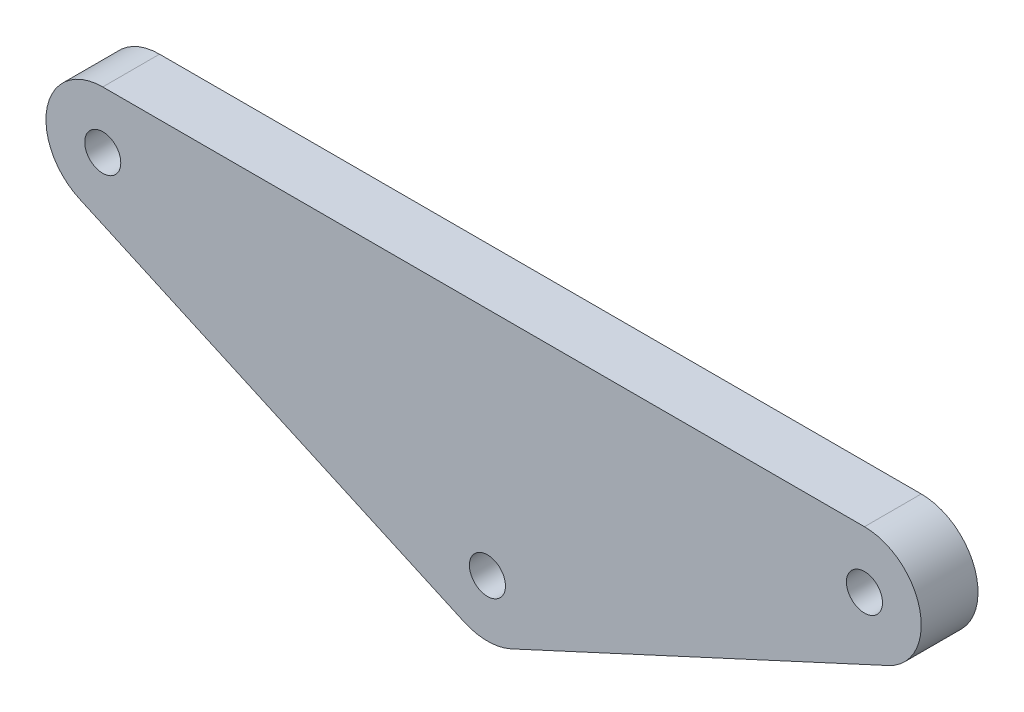
ISO-10303-21;
HEADER;
FILE_DESCRIPTION(('STEP AP214'),'2;1');
FILE_NAME('part.step','',(''),(''),'','','');
FILE_SCHEMA(('AUTOMOTIVE_DESIGN { 1 0 10303 214 1 1 1 1 }'));
ENDSEC;
DATA;
#1=APPLICATION_CONTEXT('core data for automotive mechanical design processes');
#2=APPLICATION_PROTOCOL_DEFINITION('international standard','automotive_design',2000,#1);
#3=PRODUCT_CONTEXT('',#1,'mechanical');
#4=PRODUCT('Part','Part','',(#3));
#5=PRODUCT_RELATED_PRODUCT_CATEGORY('part','',(#4));
#6=PRODUCT_DEFINITION_FORMATION('','',#4);
#7=PRODUCT_DEFINITION_CONTEXT('part definition',#1,'design');
#8=PRODUCT_DEFINITION('design','',#6,#7);
#9=PRODUCT_DEFINITION_SHAPE('','',#8);
#10=(LENGTH_UNIT() NAMED_UNIT(*) SI_UNIT(.MILLI.,.METRE.));
#11=(NAMED_UNIT(*) PLANE_ANGLE_UNIT() SI_UNIT($,.RADIAN.));
#12=(NAMED_UNIT(*) SI_UNIT($,.STERADIAN.) SOLID_ANGLE_UNIT());
#13=UNCERTAINTY_MEASURE_WITH_UNIT(LENGTH_MEASURE(1.E-05),#10,'distance_accuracy_value','');
#14=(GEOMETRIC_REPRESENTATION_CONTEXT(3) GLOBAL_UNCERTAINTY_ASSIGNED_CONTEXT((#13)) GLOBAL_UNIT_ASSIGNED_CONTEXT((#10,
#11,#12)) REPRESENTATION_CONTEXT('',''));
#15=CARTESIAN_POINT('',(0.,0.,0.));
#16=DIRECTION('',(0.,0.,1.));
#17=DIRECTION('',(1.,0.,0.));
#18=AXIS2_PLACEMENT_3D('',#15,#16,#17);
#19=CARTESIAN_POINT('',(-33.54,0.,2.5));
#20=DIRECTION('',(0.,0.,-1.));
#21=DIRECTION('',(-1.,0.,0.));
#22=AXIS2_PLACEMENT_3D('',#19,#20,#21);
#23=CYLINDRICAL_SURFACE('',#22,5.);
#24=CARTESIAN_POINT('',(-33.54,0.,-2.5));
#25=DIRECTION('',(0.,0.,1.));
#26=DIRECTION('',(1.,0.,0.));
#27=AXIS2_PLACEMENT_3D('',#24,#25,#26);
#28=CIRCLE('',#27,5.);
#29=CARTESIAN_POINT('',(-33.54,5.,-2.5));
#30=VERTEX_POINT('',#29);
#31=CARTESIAN_POINT('',(-35.6012701010741,-4.55534472574997,-2.5));
#32=VERTEX_POINT('',#31);
#33=EDGE_CURVE('E123',#30,#32,#28,.T.);
#34=ORIENTED_EDGE('',*,*,#33,.T.);
#35=DIRECTION('',(0.,0.,-1.));
#36=VECTOR('',#35,1.);
#37=CARTESIAN_POINT('',(-35.6012701010741,-4.55534472574997,2.5));
#38=LINE('',#37,#36);
#39=CARTESIAN_POINT('',(-35.6012701010741,-4.55534472574997,2.5));
#40=VERTEX_POINT('',#39);
#41=EDGE_CURVE('E11',#40,#32,#38,.T.);
#42=ORIENTED_EDGE('',*,*,#41,.F.);
#43=CARTESIAN_POINT('',(-33.54,0.,2.5));
#44=DIRECTION('',(0.,0.,1.));
#45=DIRECTION('',(1.,0.,0.));
#46=AXIS2_PLACEMENT_3D('',#43,#44,#45);
#47=CIRCLE('',#46,5.);
#48=CARTESIAN_POINT('',(-33.54,5.,2.5));
#49=VERTEX_POINT('',#48);
#50=EDGE_CURVE('E134',#49,#40,#47,.T.);
#51=ORIENTED_EDGE('',*,*,#50,.F.);
#52=DIRECTION('',(0.,0.,-1.));
#53=VECTOR('',#52,1.);
#54=CARTESIAN_POINT('',(-33.54,5.,2.5));
#55=LINE('',#54,#53);
#56=EDGE_CURVE('E119',#49,#30,#55,.T.);
#57=ORIENTED_EDGE('',*,*,#56,.T.);
#58=EDGE_LOOP('',(#34,#42,#51,#57));
#59=FACE_BOUND('',#58,.T.);
#60=ADVANCED_FACE('F39',(#59),#23,.T.);
#61=CARTESIAN_POINT('',(-1.72317137567157,-19.8850104674379,2.5));
#62=DIRECTION('',(0.412254020214816,0.911068945149994,0.));
#63=DIRECTION('',(-0.911068945149994,0.412254020214816,0.));
#64=AXIS2_PLACEMENT_3D('',#61,#62,#63);
#65=PLANE('',#64);
#66=DIRECTION('',(0.911068945149994,-0.412254020214816,0.));
#67=VECTOR('',#66,1.);
#68=CARTESIAN_POINT('',(-1.72317137567157,-19.8850104674379,-2.5));
#69=LINE('',#68,#67);
#70=CARTESIAN_POINT('',(-1.72317137567157,-19.8850104674379,-2.5));
#71=VERTEX_POINT('',#70);
#72=EDGE_CURVE('E126',#32,#71,#69,.T.);
#73=ORIENTED_EDGE('',*,*,#72,.T.);
#74=DIRECTION('',(0.,0.,-1.));
#75=VECTOR('',#74,1.);
#76=CARTESIAN_POINT('',(-1.72317137567157,-19.8850104674379,2.5));
#77=LINE('',#76,#75);
#78=CARTESIAN_POINT('',(-1.72317137567157,-19.8850104674379,2.5));
#79=VERTEX_POINT('',#78);
#80=EDGE_CURVE('E47',#79,#71,#77,.T.);
#81=ORIENTED_EDGE('',*,*,#80,.F.);
#82=DIRECTION('',(0.911068945149994,-0.412254020214816,0.));
#83=VECTOR('',#82,1.);
#84=CARTESIAN_POINT('',(-1.72317137567157,-19.8850104674379,2.5));
#85=LINE('',#84,#83);
#86=EDGE_CURVE('E92',#40,#79,#85,.T.);
#87=ORIENTED_EDGE('',*,*,#86,.F.);
#88=ORIENTED_EDGE('',*,*,#41,.T.);
#89=EDGE_LOOP('',(#73,#81,#87,#88));
#90=FACE_BOUND('',#89,.T.);
#91=ADVANCED_FACE('F160',(#90),#65,.F.);
#92=CARTESIAN_POINT('',(0.338098725402507,-15.3296657416879,2.5));
#93=DIRECTION('',(0.,0.,-1.));
#94=DIRECTION('',(-1.,0.,0.));
#95=AXIS2_PLACEMENT_3D('',#92,#93,#94);
#96=CYLINDRICAL_SURFACE('',#95,5.);
#97=CARTESIAN_POINT('',(0.338098725402507,-15.3296657416879,-2.5));
#98=DIRECTION('',(0.,0.,1.));
#99=DIRECTION('',(1.,0.,0.));
#100=AXIS2_PLACEMENT_3D('',#97,#98,#99);
#101=CIRCLE('',#100,5.);
#102=CARTESIAN_POINT('',(2.43403333596963,-19.8691655057838,-2.5));
#103=VERTEX_POINT('',#102);
#104=EDGE_CURVE('E129',#71,#103,#101,.T.);
#105=ORIENTED_EDGE('',*,*,#104,.T.);
#106=DIRECTION('',(0.,0.,-1.));
#107=VECTOR('',#106,1.);
#108=CARTESIAN_POINT('',(2.43403333596963,-19.8691655057838,2.5));
#109=LINE('',#108,#107);
#110=CARTESIAN_POINT('',(2.43403333596963,-19.8691655057838,2.5));
#111=VERTEX_POINT('',#110);
#112=EDGE_CURVE('E114',#111,#103,#109,.T.);
#113=ORIENTED_EDGE('',*,*,#112,.F.);
#114=CARTESIAN_POINT('',(0.338098725402507,-15.3296657416879,2.5));
#115=DIRECTION('',(0.,0.,1.));
#116=DIRECTION('',(1.,0.,0.));
#117=AXIS2_PLACEMENT_3D('',#114,#115,#116);
#118=CIRCLE('',#117,5.);
#119=EDGE_CURVE('E105',#79,#111,#118,.T.);
#120=ORIENTED_EDGE('',*,*,#119,.F.);
#121=ORIENTED_EDGE('',*,*,#80,.T.);
#122=EDGE_LOOP('',(#105,#113,#120,#121));
#123=FACE_BOUND('',#122,.T.);
#124=ADVANCED_FACE('F140',(#123),#96,.T.);
#125=CARTESIAN_POINT('',(2.43403333596963,-19.8691655057838,2.5));
#126=DIRECTION('',(-0.419186922113425,0.907899952819182,0.));
#127=DIRECTION('',(-0.907899952819182,-0.419186922113425,0.));
#128=AXIS2_PLACEMENT_3D('',#125,#126,#127);
#129=PLANE('',#128);
#130=DIRECTION('',(0.907899952819182,0.419186922113425,0.));
#131=VECTOR('',#130,1.);
#132=CARTESIAN_POINT('',(2.43403333596963,-19.8691655057838,-2.5));
#133=LINE('',#132,#131);
#134=CARTESIAN_POINT('',(35.6359346105671,-4.53949976409591,-2.5));
#135=VERTEX_POINT('',#134);
#136=EDGE_CURVE('E113',#103,#135,#133,.T.);
#137=ORIENTED_EDGE('',*,*,#136,.T.);
#138=DIRECTION('',(0.,0.,-1.));
#139=VECTOR('',#138,1.);
#140=CARTESIAN_POINT('',(35.6359346105671,-4.53949976409591,2.5));
#141=LINE('',#140,#139);
#142=CARTESIAN_POINT('',(35.6359346105671,-4.53949976409591,2.5));
#143=VERTEX_POINT('',#142);
#144=EDGE_CURVE('E110',#143,#135,#141,.T.);
#145=ORIENTED_EDGE('',*,*,#144,.F.);
#146=DIRECTION('',(0.907899952819182,0.419186922113425,0.));
#147=VECTOR('',#146,1.);
#148=CARTESIAN_POINT('',(2.43403333596963,-19.8691655057838,2.5));
#149=LINE('',#148,#147);
#150=EDGE_CURVE('E99',#111,#143,#149,.T.);
#151=ORIENTED_EDGE('',*,*,#150,.F.);
#152=ORIENTED_EDGE('',*,*,#112,.T.);
#153=EDGE_LOOP('',(#137,#145,#151,#152));
#154=FACE_BOUND('',#153,.T.);
#155=ADVANCED_FACE('F111',(#154),#129,.F.);
#156=CARTESIAN_POINT('',(33.54,0.,2.5));
#157=DIRECTION('',(0.,0.,-1.));
#158=DIRECTION('',(-1.,0.,0.));
#159=AXIS2_PLACEMENT_3D('',#156,#157,#158);
#160=CYLINDRICAL_SURFACE('',#159,5.);
#161=CARTESIAN_POINT('',(33.54,0.,-2.5));
#162=DIRECTION('',(0.,0.,1.));
#163=DIRECTION('',(-1.,0.,0.));
#164=AXIS2_PLACEMENT_3D('',#161,#162,#163);
#165=CIRCLE('',#164,5.);
#166=CARTESIAN_POINT('',(33.54,5.,-2.5));
#167=VERTEX_POINT('',#166);
#168=EDGE_CURVE('E78',#135,#167,#165,.T.);
#169=ORIENTED_EDGE('',*,*,#168,.T.);
#170=DIRECTION('',(0.,0.,-1.));
#171=VECTOR('',#170,1.);
#172=CARTESIAN_POINT('',(33.54,5.,2.5));
#173=LINE('',#172,#171);
#174=CARTESIAN_POINT('',(33.54,5.,2.5));
#175=VERTEX_POINT('',#174);
#176=EDGE_CURVE('E115',#175,#167,#173,.T.);
#177=ORIENTED_EDGE('',*,*,#176,.F.);
#178=CARTESIAN_POINT('',(33.54,0.,2.5));
#179=DIRECTION('',(0.,0.,1.));
#180=DIRECTION('',(-1.,0.,0.));
#181=AXIS2_PLACEMENT_3D('',#178,#179,#180);
#182=CIRCLE('',#181,5.);
#183=EDGE_CURVE('E103',#143,#175,#182,.T.);
#184=ORIENTED_EDGE('',*,*,#183,.F.);
#185=ORIENTED_EDGE('',*,*,#144,.T.);
#186=EDGE_LOOP('',(#169,#177,#184,#185));
#187=FACE_BOUND('',#186,.T.);
#188=ADVANCED_FACE('F117',(#187),#160,.T.);
#189=CARTESIAN_POINT('',(-33.54,5.,2.5));
#190=DIRECTION('',(0.,-1.,0.));
#191=DIRECTION('',(0.,0.,-1.));
#192=AXIS2_PLACEMENT_3D('',#189,#190,#191);
#193=PLANE('',#192);
#194=DIRECTION('',(-1.,0.,0.));
#195=VECTOR('',#194,1.);
#196=CARTESIAN_POINT('',(-33.54,5.,-2.5));
#197=LINE('',#196,#195);
#198=EDGE_CURVE('E84',#167,#30,#197,.T.);
#199=ORIENTED_EDGE('',*,*,#198,.T.);
#200=ORIENTED_EDGE('',*,*,#56,.F.);
#201=DIRECTION('',(-1.,0.,0.));
#202=VECTOR('',#201,1.);
#203=CARTESIAN_POINT('',(-33.54,5.,2.5));
#204=LINE('',#203,#202);
#205=EDGE_CURVE('E55',#175,#49,#204,.T.);
#206=ORIENTED_EDGE('',*,*,#205,.F.);
#207=ORIENTED_EDGE('',*,*,#176,.T.);
#208=EDGE_LOOP('',(#199,#200,#206,#207));
#209=FACE_BOUND('',#208,.T.);
#210=ADVANCED_FACE('F147',(#209),#193,.F.);
#211=CARTESIAN_POINT('',(-33.54,0.,2.5));
#212=DIRECTION('',(0.,0.,1.));
#213=DIRECTION('',(1.,0.,0.));
#214=AXIS2_PLACEMENT_3D('',#211,#212,#213);
#215=PLANE('',#214);
#216=CARTESIAN_POINT('',(-33.54,0.,2.5));
#217=DIRECTION('',(0.,0.,1.));
#218=DIRECTION('',(1.,0.,0.));
#219=AXIS2_PLACEMENT_3D('',#216,#217,#218);
#220=CIRCLE('',#219,1.5875);
#221=CARTESIAN_POINT('',(-31.9525,0.,2.5));
#222=VERTEX_POINT('',#221);
#223=EDGE_CURVE('E230',#222,#222,#220,.T.);
#224=ORIENTED_EDGE('',*,*,#223,.F.);
#225=EDGE_LOOP('',(#224));
#226=FACE_BOUND('',#225,.T.);
#227=CARTESIAN_POINT('',(33.54,0.,2.5));
#228=DIRECTION('',(0.,0.,1.));
#229=DIRECTION('',(1.,0.,0.));
#230=AXIS2_PLACEMENT_3D('',#227,#228,#229);
#231=CIRCLE('',#230,1.5875);
#232=CARTESIAN_POINT('',(35.1275,0.,2.5));
#233=VERTEX_POINT('',#232);
#234=EDGE_CURVE('E235',#233,#233,#231,.T.);
#235=ORIENTED_EDGE('',*,*,#234,.F.);
#236=EDGE_LOOP('',(#235));
#237=FACE_BOUND('',#236,.T.);
#238=CARTESIAN_POINT('',(0.338098725402507,-15.3296657416879,2.5));
#239=DIRECTION('',(0.,0.,1.));
#240=DIRECTION('',(1.,0.,0.));
#241=AXIS2_PLACEMENT_3D('',#238,#239,#240);
#242=CIRCLE('',#241,1.5875);
#243=CARTESIAN_POINT('',(1.92559872540251,-15.3296657416879,2.5));
#244=VERTEX_POINT('',#243);
#245=EDGE_CURVE('E243',#244,#244,#242,.T.);
#246=ORIENTED_EDGE('',*,*,#245,.F.);
#247=EDGE_LOOP('',(#246));
#248=FACE_BOUND('',#247,.T.);
#249=ORIENTED_EDGE('',*,*,#50,.T.);
#250=ORIENTED_EDGE('',*,*,#86,.T.);
#251=ORIENTED_EDGE('',*,*,#119,.T.);
#252=ORIENTED_EDGE('',*,*,#150,.T.);
#253=ORIENTED_EDGE('',*,*,#183,.T.);
#254=ORIENTED_EDGE('',*,*,#205,.T.);
#255=EDGE_LOOP('',(#249,#250,#251,#252,#253,#254));
#256=FACE_BOUND('',#255,.T.);
#257=ADVANCED_FACE('F101',(#226,#237,#248,#256),#215,.T.);
#258=CARTESIAN_POINT('',(-33.54,0.,-2.5));
#259=DIRECTION('',(0.,0.,1.));
#260=DIRECTION('',(1.,0.,0.));
#261=AXIS2_PLACEMENT_3D('',#258,#259,#260);
#262=PLANE('',#261);
#263=CARTESIAN_POINT('',(-33.54,0.,-2.5));
#264=DIRECTION('',(0.,0.,1.));
#265=DIRECTION('',(1.,0.,0.));
#266=AXIS2_PLACEMENT_3D('',#263,#264,#265);
#267=CIRCLE('',#266,1.5875);
#268=CARTESIAN_POINT('',(-31.9525,0.,-2.5));
#269=VERTEX_POINT('',#268);
#270=EDGE_CURVE('E127',#269,#269,#267,.T.);
#271=ORIENTED_EDGE('',*,*,#270,.T.);
#272=EDGE_LOOP('',(#271));
#273=FACE_BOUND('',#272,.T.);
#274=CARTESIAN_POINT('',(33.54,0.,-2.5));
#275=DIRECTION('',(0.,0.,1.));
#276=DIRECTION('',(1.,0.,0.));
#277=AXIS2_PLACEMENT_3D('',#274,#275,#276);
#278=CIRCLE('',#277,1.5875);
#279=CARTESIAN_POINT('',(35.1275,0.,-2.5));
#280=VERTEX_POINT('',#279);
#281=EDGE_CURVE('E231',#280,#280,#278,.T.);
#282=ORIENTED_EDGE('',*,*,#281,.T.);
#283=EDGE_LOOP('',(#282));
#284=FACE_BOUND('',#283,.T.);
#285=CARTESIAN_POINT('',(0.338098725402507,-15.3296657416879,-2.5));
#286=DIRECTION('',(0.,0.,1.));
#287=DIRECTION('',(1.,0.,0.));
#288=AXIS2_PLACEMENT_3D('',#285,#286,#287);
#289=CIRCLE('',#288,1.5875);
#290=CARTESIAN_POINT('',(1.92559872540251,-15.3296657416879,-2.5));
#291=VERTEX_POINT('',#290);
#292=EDGE_CURVE('E240',#291,#291,#289,.T.);
#293=ORIENTED_EDGE('',*,*,#292,.T.);
#294=EDGE_LOOP('',(#293));
#295=FACE_BOUND('',#294,.T.);
#296=ORIENTED_EDGE('',*,*,#33,.F.);
#297=ORIENTED_EDGE('',*,*,#198,.F.);
#298=ORIENTED_EDGE('',*,*,#168,.F.);
#299=ORIENTED_EDGE('',*,*,#136,.F.);
#300=ORIENTED_EDGE('',*,*,#104,.F.);
#301=ORIENTED_EDGE('',*,*,#72,.F.);
#302=EDGE_LOOP('',(#296,#297,#298,#299,#300,#301));
#303=FACE_BOUND('',#302,.T.);
#304=ADVANCED_FACE('F143',(#273,#284,#295,#303),#262,.F.);
#305=CARTESIAN_POINT('',(0.338098725402507,-15.3296657416879,-2.5));
#306=DIRECTION('',(0.,0.,1.));
#307=DIRECTION('',(1.,0.,0.));
#308=AXIS2_PLACEMENT_3D('',#305,#306,#307);
#309=CYLINDRICAL_SURFACE('',#308,1.5875);
#310=ORIENTED_EDGE('',*,*,#292,.F.);
#311=EDGE_LOOP('',(#310));
#312=FACE_BOUND('',#311,.T.);
#313=ORIENTED_EDGE('',*,*,#245,.T.);
#314=EDGE_LOOP('',(#313));
#315=FACE_BOUND('',#314,.T.);
#316=ADVANCED_FACE('F193',(#312,#315),#309,.F.);
#317=CARTESIAN_POINT('',(33.54,0.,-2.5));
#318=DIRECTION('',(0.,0.,1.));
#319=DIRECTION('',(1.,0.,0.));
#320=AXIS2_PLACEMENT_3D('',#317,#318,#319);
#321=CYLINDRICAL_SURFACE('',#320,1.5875);
#322=ORIENTED_EDGE('',*,*,#281,.F.);
#323=EDGE_LOOP('',(#322));
#324=FACE_BOUND('',#323,.T.);
#325=ORIENTED_EDGE('',*,*,#234,.T.);
#326=EDGE_LOOP('',(#325));
#327=FACE_BOUND('',#326,.T.);
#328=ADVANCED_FACE('F201',(#324,#327),#321,.F.);
#329=CARTESIAN_POINT('',(-33.54,0.,-2.5));
#330=DIRECTION('',(0.,0.,1.));
#331=DIRECTION('',(1.,0.,0.));
#332=AXIS2_PLACEMENT_3D('',#329,#330,#331);
#333=CYLINDRICAL_SURFACE('',#332,1.5875);
#334=ORIENTED_EDGE('',*,*,#270,.F.);
#335=EDGE_LOOP('',(#334));
#336=FACE_BOUND('',#335,.T.);
#337=ORIENTED_EDGE('',*,*,#223,.T.);
#338=EDGE_LOOP('',(#337));
#339=FACE_BOUND('',#338,.T.);
#340=ADVANCED_FACE('F211',(#336,#339),#333,.F.);
#341=CLOSED_SHELL('',(#60,#91,#124,#155,#188,#210,#257,#304,#316,#328,#340));
#342=MANIFOLD_SOLID_BREP('B2',#341);
#343=ADVANCED_BREP_SHAPE_REPRESENTATION('',(#18,#342),#14);
#344=SHAPE_DEFINITION_REPRESENTATION(#9,#343);
ENDSEC;
END-ISO-10303-21;
